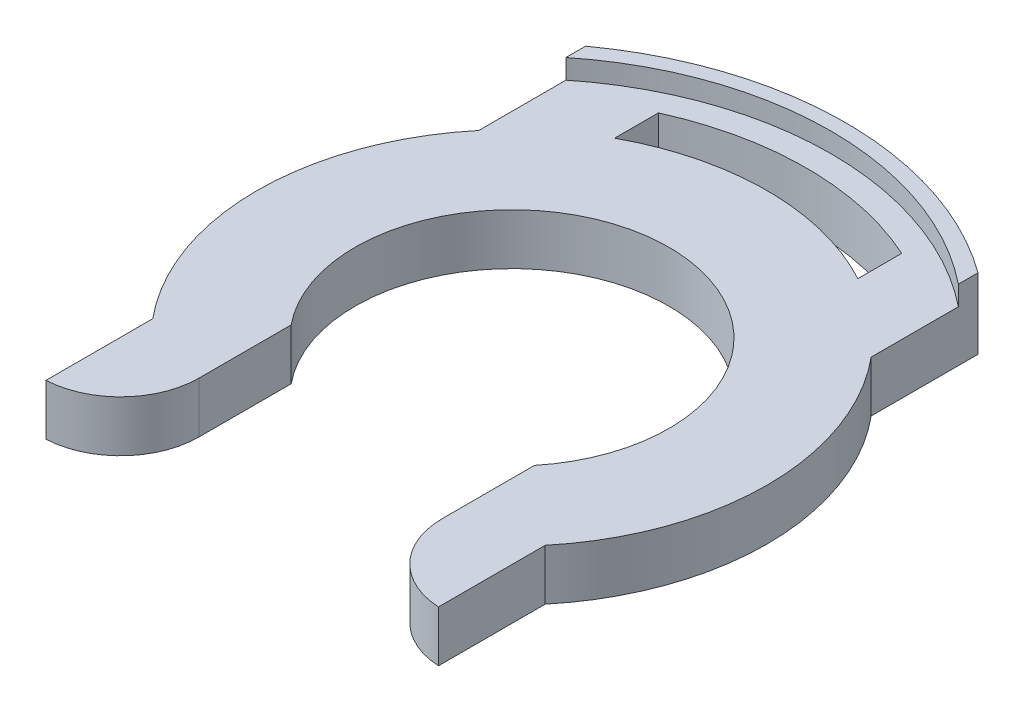
ISO-10303-21;
HEADER;
FILE_DESCRIPTION(('STEP AP214'),'2;1');
FILE_NAME('part.step','',(''),(''),'','','');
FILE_SCHEMA(('AUTOMOTIVE_DESIGN { 1 0 10303 214 1 1 1 1 }'));
ENDSEC;
DATA;
#1=APPLICATION_CONTEXT('core data for automotive mechanical design processes');
#2=APPLICATION_PROTOCOL_DEFINITION('international standard','automotive_design',2000,#1);
#3=PRODUCT_CONTEXT('',#1,'mechanical');
#4=PRODUCT('Part','Part','',(#3));
#5=PRODUCT_RELATED_PRODUCT_CATEGORY('part','',(#4));
#6=PRODUCT_DEFINITION_FORMATION('','',#4);
#7=PRODUCT_DEFINITION_CONTEXT('part definition',#1,'design');
#8=PRODUCT_DEFINITION('design','',#6,#7);
#9=PRODUCT_DEFINITION_SHAPE('','',#8);
#10=(LENGTH_UNIT() NAMED_UNIT(*) SI_UNIT(.MILLI.,.METRE.));
#11=(NAMED_UNIT(*) PLANE_ANGLE_UNIT() SI_UNIT($,.RADIAN.));
#12=(NAMED_UNIT(*) SI_UNIT($,.STERADIAN.) SOLID_ANGLE_UNIT());
#13=UNCERTAINTY_MEASURE_WITH_UNIT(LENGTH_MEASURE(1.E-05),#10,'distance_accuracy_value','');
#14=(GEOMETRIC_REPRESENTATION_CONTEXT(3) GLOBAL_UNCERTAINTY_ASSIGNED_CONTEXT((#13)) GLOBAL_UNIT_ASSIGNED_CONTEXT((#10,
#11,#12)) REPRESENTATION_CONTEXT('',''));
#15=CARTESIAN_POINT('',(0.,0.,0.));
#16=DIRECTION('',(0.,0.,1.));
#17=DIRECTION('',(1.,0.,0.));
#18=AXIS2_PLACEMENT_3D('',#15,#16,#17);
#19=CARTESIAN_POINT('',(0.,1.3,0.));
#20=DIRECTION('',(0.,1.,0.));
#21=DIRECTION('',(0.,0.,1.));
#22=AXIS2_PLACEMENT_3D('',#19,#20,#21);
#23=PLANE('',#22);
#24=DIRECTION('',(0.,0.,1.));
#25=VECTOR('',#24,1.);
#26=CARTESIAN_POINT('',(-34.3634624020238,1.3,0.));
#27=LINE('',#26,#25);
#28=CARTESIAN_POINT('',(-34.3634624020238,1.3,-13.1649759695658));
#29=VERTEX_POINT('',#28);
#30=CARTESIAN_POINT('',(-34.3634624020238,1.3,-12.0487702808145));
#31=VERTEX_POINT('',#30);
#32=EDGE_CURVE('E205',#29,#31,#27,.T.);
#33=ORIENTED_EDGE('',*,*,#32,.F.);
#34=CARTESIAN_POINT('',(-31.2634624020238,1.3,-6.33562753798022));
#35=DIRECTION('',(0.,1.,0.));
#36=DIRECTION('',(0.,0.,1.));
#37=AXIS2_PLACEMENT_3D('',#34,#35,#36);
#38=CIRCLE('',#37,7.5);
#39=CARTESIAN_POINT('',(-28.1634624020238,1.3,-13.1649759695658));
#40=VERTEX_POINT('',#39);
#41=EDGE_CURVE('E209',#40,#29,#38,.T.);
#42=ORIENTED_EDGE('',*,*,#41,.F.);
#43=DIRECTION('',(0.,0.,1.));
#44=VECTOR('',#43,1.);
#45=CARTESIAN_POINT('',(-28.1634624020238,1.3,0.));
#46=LINE('',#45,#44);
#47=CARTESIAN_POINT('',(-28.1634624020238,1.3,-12.0487702808145));
#48=VERTEX_POINT('',#47);
#49=EDGE_CURVE('E214',#40,#48,#46,.T.);
#50=ORIENTED_EDGE('',*,*,#49,.T.);
#51=CARTESIAN_POINT('',(-31.2634624020238,1.3,-6.33562753798022));
#52=DIRECTION('',(0.,1.,0.));
#53=DIRECTION('',(0.,0.,1.));
#54=AXIS2_PLACEMENT_3D('',#51,#52,#53);
#55=CIRCLE('',#54,6.5);
#56=EDGE_CURVE('E217',#48,#31,#55,.T.);
#57=ORIENTED_EDGE('',*,*,#56,.T.);
#58=EDGE_LOOP('',(#33,#42,#50,#57));
#59=FACE_BOUND('',#58,.T.);
#60=CARTESIAN_POINT('',(-31.2634624020238,1.3,-6.46449308201558));
#61=DIRECTION('',(0.,-1.,0.));
#62=DIRECTION('',(0.,0.,-1.));
#63=AXIS2_PLACEMENT_3D('',#60,#61,#62);
#64=CIRCLE('',#63,8.);
#65=CARTESIAN_POINT('',(-36.2634624020238,1.3,-12.709491080414));
#66=VERTEX_POINT('',#65);
#67=CARTESIAN_POINT('',(-26.2634624020238,1.3,-12.709491080414));
#68=VERTEX_POINT('',#67);
#69=EDGE_CURVE('E57',#66,#68,#64,.T.);
#70=ORIENTED_EDGE('',*,*,#69,.F.);
#71=DIRECTION('',(0.,0.,-1.));
#72=VECTOR('',#71,1.);
#73=CARTESIAN_POINT('',(-36.2634624020238,1.3,0.));
#74=LINE('',#73,#72);
#75=CARTESIAN_POINT('',(-36.2634624020238,1.3,-10.4889394694393));
#76=VERTEX_POINT('',#75);
#77=EDGE_CURVE('E232',#76,#66,#74,.T.);
#78=ORIENTED_EDGE('',*,*,#77,.F.);
#79=CARTESIAN_POINT('',(-31.2634624020238,1.3,-6.33562753798022));
#80=DIRECTION('',(0.,1.,0.));
#81=DIRECTION('',(0.,0.,1.));
#82=AXIS2_PLACEMENT_3D('',#79,#80,#81);
#83=CIRCLE('',#82,6.5);
#84=CARTESIAN_POINT('',(-36.2634624020238,1.3,-2.18231560652117));
#85=VERTEX_POINT('',#84);
#86=EDGE_CURVE('E235',#76,#85,#83,.T.);
#87=ORIENTED_EDGE('',*,*,#86,.T.);
#88=DIRECTION('',(0.,0.,-1.));
#89=VECTOR('',#88,1.);
#90=CARTESIAN_POINT('',(-36.2634624020238,1.3,0.));
#91=LINE('',#90,#89);
#92=CARTESIAN_POINT('',(-36.2634624020238,1.3,0.538236004453547));
#93=VERTEX_POINT('',#92);
#94=EDGE_CURVE('E238',#93,#85,#91,.T.);
#95=ORIENTED_EDGE('',*,*,#94,.F.);
#96=CARTESIAN_POINT('',(-36.3634624020238,1.3,-1.45926243109027));
#97=DIRECTION('',(0.,1.,0.));
#98=DIRECTION('',(0.,0.,1.));
#99=AXIS2_PLACEMENT_3D('',#96,#97,#98);
#100=CIRCLE('',#99,2.);
#101=CARTESIAN_POINT('',(-34.3634624020238,1.3,-1.45926243109027));
#102=VERTEX_POINT('',#101);
#103=EDGE_CURVE('E50',#93,#102,#100,.T.);
#104=ORIENTED_EDGE('',*,*,#103,.T.);
#105=DIRECTION('',(0.,0.,1.));
#106=VECTOR('',#105,1.);
#107=CARTESIAN_POINT('',(-34.3634624020238,1.3,0.));
#108=LINE('',#107,#106);
#109=CARTESIAN_POINT('',(-34.3634624020238,1.3,-3.8077826060273));
#110=VERTEX_POINT('',#109);
#111=EDGE_CURVE('E242',#110,#102,#108,.T.);
#112=ORIENTED_EDGE('',*,*,#111,.F.);
#113=CARTESIAN_POINT('',(-31.2634624020238,1.3,-6.33562753798022));
#114=DIRECTION('',(0.,1.,0.));
#115=DIRECTION('',(0.,0.,1.));
#116=AXIS2_PLACEMENT_3D('',#113,#114,#115);
#117=CIRCLE('',#116,4.);
#118=CARTESIAN_POINT('',(-28.1634624020238,1.3,-3.80778260602731));
#119=VERTEX_POINT('',#118);
#120=EDGE_CURVE('E246',#119,#110,#117,.T.);
#121=ORIENTED_EDGE('',*,*,#120,.F.);
#122=DIRECTION('',(0.,0.,1.));
#123=VECTOR('',#122,1.);
#124=CARTESIAN_POINT('',(-28.1634624020238,1.3,0.));
#125=LINE('',#124,#123);
#126=CARTESIAN_POINT('',(-28.1634624020238,1.3,-1.45926243109027));
#127=VERTEX_POINT('',#126);
#128=EDGE_CURVE('E220',#119,#127,#125,.T.);
#129=ORIENTED_EDGE('',*,*,#128,.T.);
#130=CARTESIAN_POINT('',(-26.1634624020238,1.3,-1.45926243109027));
#131=DIRECTION('',(0.,1.,0.));
#132=DIRECTION('',(0.,0.,1.));
#133=AXIS2_PLACEMENT_3D('',#130,#131,#132);
#134=CIRCLE('',#133,2.);
#135=CARTESIAN_POINT('',(-26.2634624020238,1.3,0.538236004453544));
#136=VERTEX_POINT('',#135);
#137=EDGE_CURVE('E351',#127,#136,#134,.T.);
#138=ORIENTED_EDGE('',*,*,#137,.T.);
#139=DIRECTION('',(0.,0.,-1.));
#140=VECTOR('',#139,1.);
#141=CARTESIAN_POINT('',(-26.2634624020238,1.3,0.));
#142=LINE('',#141,#140);
#143=CARTESIAN_POINT('',(-26.2634624020238,1.3,-2.18231560652118));
#144=VERTEX_POINT('',#143);
#145=EDGE_CURVE('E223',#136,#144,#142,.T.);
#146=ORIENTED_EDGE('',*,*,#145,.T.);
#147=CARTESIAN_POINT('',(-31.2634624020238,1.3,-6.33562753798022));
#148=DIRECTION('',(0.,1.,0.));
#149=DIRECTION('',(0.,0.,1.));
#150=AXIS2_PLACEMENT_3D('',#147,#148,#149);
#151=CIRCLE('',#150,6.5);
#152=CARTESIAN_POINT('',(-26.2634624020238,1.3,-10.4889394694393));
#153=VERTEX_POINT('',#152);
#154=EDGE_CURVE('E226',#144,#153,#151,.T.);
#155=ORIENTED_EDGE('',*,*,#154,.T.);
#156=DIRECTION('',(0.,0.,-1.));
#157=VECTOR('',#156,1.);
#158=CARTESIAN_POINT('',(-26.2634624020238,1.3,0.));
#159=LINE('',#158,#157);
#160=EDGE_CURVE('E229',#153,#68,#159,.T.);
#161=ORIENTED_EDGE('',*,*,#160,.T.);
#162=EDGE_LOOP('',(#70,#78,#87,#95,#104,#112,#121,#129,#138,#146,#155,#161));
#163=FACE_BOUND('',#162,.T.);
#164=ADVANCED_FACE('F41',(#59,#163),#23,.T.);
#165=CARTESIAN_POINT('',(-28.1634624020238,1.3,0.));
#166=DIRECTION('',(1.,0.,0.));
#167=DIRECTION('',(0.,0.,-1.));
#168=AXIS2_PLACEMENT_3D('',#165,#166,#167);
#169=PLANE('',#168);
#170=DIRECTION('',(0.,0.,1.));
#171=VECTOR('',#170,1.);
#172=CARTESIAN_POINT('',(-28.1634624020238,0.,0.));
#173=LINE('',#172,#171);
#174=CARTESIAN_POINT('',(-28.1634624020238,0.,-3.80778260602731));
#175=VERTEX_POINT('',#174);
#176=CARTESIAN_POINT('',(-28.1634624020238,0.,-1.45926243109027));
#177=VERTEX_POINT('',#176);
#178=EDGE_CURVE('E261',#175,#177,#173,.T.);
#179=ORIENTED_EDGE('',*,*,#178,.T.);
#180=DIRECTION('',(0.,-1.,0.));
#181=VECTOR('',#180,1.);
#182=CARTESIAN_POINT('',(-28.1634624020238,1.3,-1.45926243109027));
#183=LINE('',#182,#181);
#184=EDGE_CURVE('E11',#177,#127,#183,.F.);
#185=ORIENTED_EDGE('',*,*,#184,.T.);
#186=ORIENTED_EDGE('',*,*,#128,.F.);
#187=DIRECTION('',(0.,-1.,0.));
#188=VECTOR('',#187,1.);
#189=CARTESIAN_POINT('',(-28.1634624020238,1.3,-3.80778260602731));
#190=LINE('',#189,#188);
#191=EDGE_CURVE('E296',#119,#175,#190,.T.);
#192=ORIENTED_EDGE('',*,*,#191,.T.);
#193=EDGE_LOOP('',(#179,#185,#186,#192));
#194=FACE_BOUND('',#193,.T.);
#195=ADVANCED_FACE('F395',(#194),#169,.F.);
#196=CARTESIAN_POINT('',(-26.2634624020238,1.3,0.));
#197=DIRECTION('',(-1.,0.,0.));
#198=DIRECTION('',(0.,0.,1.));
#199=AXIS2_PLACEMENT_3D('',#196,#197,#198);
#200=PLANE('',#199);
#201=DIRECTION('',(0.,0.,-1.));
#202=VECTOR('',#201,1.);
#203=CARTESIAN_POINT('',(-26.2634624020238,0.,0.));
#204=LINE('',#203,#202);
#205=CARTESIAN_POINT('',(-26.2634624020238,0.,0.538236004453544));
#206=VERTEX_POINT('',#205);
#207=CARTESIAN_POINT('',(-26.2634624020238,0.,-2.18231560652118));
#208=VERTEX_POINT('',#207);
#209=EDGE_CURVE('E264',#206,#208,#204,.T.);
#210=ORIENTED_EDGE('',*,*,#209,.T.);
#211=DIRECTION('',(0.,-1.,0.));
#212=VECTOR('',#211,1.);
#213=CARTESIAN_POINT('',(-26.2634624020238,1.3,-2.18231560652118));
#214=LINE('',#213,#212);
#215=EDGE_CURVE('E322',#144,#208,#214,.T.);
#216=ORIENTED_EDGE('',*,*,#215,.F.);
#217=ORIENTED_EDGE('',*,*,#145,.F.);
#218=DIRECTION('',(0.,-1.,0.));
#219=VECTOR('',#218,1.);
#220=CARTESIAN_POINT('',(-26.2634624020238,1.3,0.538236004453544));
#221=LINE('',#220,#219);
#222=EDGE_CURVE('E326',#136,#206,#221,.T.);
#223=ORIENTED_EDGE('',*,*,#222,.T.);
#224=EDGE_LOOP('',(#210,#216,#217,#223));
#225=FACE_BOUND('',#224,.T.);
#226=ADVANCED_FACE('F390',(#225),#200,.F.);
#227=CARTESIAN_POINT('',(-31.2634624020238,1.3,-6.33562753798022));
#228=DIRECTION('',(0.,-1.,0.));
#229=DIRECTION('',(0.,0.,-1.));
#230=AXIS2_PLACEMENT_3D('',#227,#228,#229);
#231=CYLINDRICAL_SURFACE('',#230,6.5);
#232=CARTESIAN_POINT('',(-31.2634624020238,0.,-6.33562753798022));
#233=DIRECTION('',(0.,1.,0.));
#234=DIRECTION('',(0.,0.,1.));
#235=AXIS2_PLACEMENT_3D('',#232,#233,#234);
#236=CIRCLE('',#235,6.5);
#237=CARTESIAN_POINT('',(-26.2634624020238,0.,-10.4889394694393));
#238=VERTEX_POINT('',#237);
#239=EDGE_CURVE('E267',#208,#238,#236,.T.);
#240=ORIENTED_EDGE('',*,*,#239,.T.);
#241=DIRECTION('',(0.,-1.,0.));
#242=VECTOR('',#241,1.);
#243=CARTESIAN_POINT('',(-26.2634624020238,1.3,-10.4889394694393));
#244=LINE('',#243,#242);
#245=EDGE_CURVE('E318',#153,#238,#244,.T.);
#246=ORIENTED_EDGE('',*,*,#245,.F.);
#247=ORIENTED_EDGE('',*,*,#154,.F.);
#248=ORIENTED_EDGE('',*,*,#215,.T.);
#249=EDGE_LOOP('',(#240,#246,#247,#248));
#250=FACE_BOUND('',#249,.T.);
#251=ADVANCED_FACE('F386',(#250),#231,.T.);
#252=CARTESIAN_POINT('',(-26.2634624020238,1.3,0.));
#253=DIRECTION('',(-1.,0.,0.));
#254=DIRECTION('',(0.,0.,1.));
#255=AXIS2_PLACEMENT_3D('',#252,#253,#254);
#256=PLANE('',#255);
#257=DIRECTION('',(0.,0.,-1.));
#258=VECTOR('',#257,1.);
#259=CARTESIAN_POINT('',(-26.2634624020238,0.,0.));
#260=LINE('',#259,#258);
#261=CARTESIAN_POINT('',(-26.2634624020238,0.,-13.209491080414));
#262=VERTEX_POINT('',#261);
#263=EDGE_CURVE('E270',#238,#262,#260,.T.);
#264=ORIENTED_EDGE('',*,*,#263,.T.);
#265=DIRECTION('',(0.,-1.,0.));
#266=VECTOR('',#265,1.);
#267=CARTESIAN_POINT('',(-26.2634624020238,1.3,-13.209491080414));
#268=LINE('',#267,#266);
#269=CARTESIAN_POINT('',(-26.2634624020238,1.8,-13.209491080414));
#270=VERTEX_POINT('',#269);
#271=EDGE_CURVE('E175',#270,#262,#268,.T.);
#272=ORIENTED_EDGE('',*,*,#271,.F.);
#273=DIRECTION('',(0.,0.,-1.));
#274=VECTOR('',#273,1.);
#275=CARTESIAN_POINT('',(-26.2634624020238,1.8,-12.709491080414));
#276=LINE('',#275,#274);
#277=CARTESIAN_POINT('',(-26.2634624020238,1.8,-12.709491080414));
#278=VERTEX_POINT('',#277);
#279=EDGE_CURVE('E168',#278,#270,#276,.T.);
#280=ORIENTED_EDGE('',*,*,#279,.F.);
#281=DIRECTION('',(0.,-1.,0.));
#282=VECTOR('',#281,1.);
#283=CARTESIAN_POINT('',(-26.2634624020238,1.8,-12.709491080414));
#284=LINE('',#283,#282);
#285=EDGE_CURVE('E173',#278,#68,#284,.T.);
#286=ORIENTED_EDGE('',*,*,#285,.T.);
#287=ORIENTED_EDGE('',*,*,#160,.F.);
#288=ORIENTED_EDGE('',*,*,#245,.T.);
#289=EDGE_LOOP('',(#264,#272,#280,#286,#287,#288));
#290=FACE_BOUND('',#289,.T.);
#291=ADVANCED_FACE('F170',(#290),#256,.F.);
#292=CARTESIAN_POINT('',(-31.2634624020238,1.3,-6.33562753798022));
#293=DIRECTION('',(0.,-1.,0.));
#294=DIRECTION('',(0.,0.,-1.));
#295=AXIS2_PLACEMENT_3D('',#292,#293,#294);
#296=CYLINDRICAL_SURFACE('',#295,8.5);
#297=CARTESIAN_POINT('',(-31.2634624020238,0.,-6.33562753798022));
#298=DIRECTION('',(0.,1.,0.));
#299=DIRECTION('',(0.,0.,1.));
#300=AXIS2_PLACEMENT_3D('',#297,#298,#299);
#301=CIRCLE('',#300,8.5);
#302=CARTESIAN_POINT('',(-36.2634624020238,0.,-13.209491080414));
#303=VERTEX_POINT('',#302);
#304=EDGE_CURVE('E273',#262,#303,#301,.T.);
#305=ORIENTED_EDGE('',*,*,#304,.T.);
#306=DIRECTION('',(0.,-1.,0.));
#307=VECTOR('',#306,1.);
#308=CARTESIAN_POINT('',(-36.2634624020238,1.3,-13.209491080414));
#309=LINE('',#308,#307);
#310=CARTESIAN_POINT('',(-36.2634624020238,1.8,-13.209491080414));
#311=VERTEX_POINT('',#310);
#312=EDGE_CURVE('E313',#311,#303,#309,.T.);
#313=ORIENTED_EDGE('',*,*,#312,.F.);
#314=CARTESIAN_POINT('',(-31.2634624020238,1.8,-6.3356275379802));
#315=DIRECTION('',(0.,1.,0.));
#316=DIRECTION('',(0.,0.,-1.));
#317=AXIS2_PLACEMENT_3D('',#314,#315,#316);
#318=CIRCLE('',#317,8.50000000000001);
#319=EDGE_CURVE('E180',#270,#311,#318,.T.);
#320=ORIENTED_EDGE('',*,*,#319,.F.);
#321=ORIENTED_EDGE('',*,*,#271,.T.);
#322=EDGE_LOOP('',(#305,#313,#320,#321));
#323=FACE_BOUND('',#322,.T.);
#324=ADVANCED_FACE('F379',(#323),#296,.T.);
#325=CARTESIAN_POINT('',(-36.2634624020238,1.3,0.));
#326=DIRECTION('',(-1.,0.,0.));
#327=DIRECTION('',(0.,0.,1.));
#328=AXIS2_PLACEMENT_3D('',#325,#326,#327);
#329=PLANE('',#328);
#330=DIRECTION('',(0.,0.,-1.));
#331=VECTOR('',#330,1.);
#332=CARTESIAN_POINT('',(-36.2634624020238,0.,0.));
#333=LINE('',#332,#331);
#334=CARTESIAN_POINT('',(-36.2634624020238,0.,-10.4889394694393));
#335=VERTEX_POINT('',#334);
#336=EDGE_CURVE('E277',#335,#303,#333,.T.);
#337=ORIENTED_EDGE('',*,*,#336,.F.);
#338=DIRECTION('',(0.,-1.,0.));
#339=VECTOR('',#338,1.);
#340=CARTESIAN_POINT('',(-36.2634624020238,1.3,-10.4889394694393));
#341=LINE('',#340,#339);
#342=EDGE_CURVE('E310',#76,#335,#341,.T.);
#343=ORIENTED_EDGE('',*,*,#342,.F.);
#344=ORIENTED_EDGE('',*,*,#77,.T.);
#345=DIRECTION('',(0.,-1.,0.));
#346=VECTOR('',#345,1.);
#347=CARTESIAN_POINT('',(-36.2634624020238,1.8,-12.709491080414));
#348=LINE('',#347,#346);
#349=CARTESIAN_POINT('',(-36.2634624020238,1.8,-12.709491080414));
#350=VERTEX_POINT('',#349);
#351=EDGE_CURVE('E195',#350,#66,#348,.T.);
#352=ORIENTED_EDGE('',*,*,#351,.F.);
#353=DIRECTION('',(0.,0.,1.));
#354=VECTOR('',#353,1.);
#355=CARTESIAN_POINT('',(-36.2634624020238,1.8,-12.709491080414));
#356=LINE('',#355,#354);
#357=EDGE_CURVE('E186',#311,#350,#356,.T.);
#358=ORIENTED_EDGE('',*,*,#357,.F.);
#359=ORIENTED_EDGE('',*,*,#312,.T.);
#360=EDGE_LOOP('',(#337,#343,#344,#352,#358,#359));
#361=FACE_BOUND('',#360,.T.);
#362=ADVANCED_FACE('F377',(#361),#329,.T.);
#363=CARTESIAN_POINT('',(-31.2634624020238,1.3,-6.33562753798022));
#364=DIRECTION('',(0.,-1.,0.));
#365=DIRECTION('',(0.,0.,-1.));
#366=AXIS2_PLACEMENT_3D('',#363,#364,#365);
#367=CYLINDRICAL_SURFACE('',#366,6.5);
#368=CARTESIAN_POINT('',(-31.2634624020238,0.,-6.33562753798022));
#369=DIRECTION('',(0.,1.,0.));
#370=DIRECTION('',(0.,0.,1.));
#371=AXIS2_PLACEMENT_3D('',#368,#369,#370);
#372=CIRCLE('',#371,6.5);
#373=CARTESIAN_POINT('',(-36.2634624020238,0.,-2.18231560652117));
#374=VERTEX_POINT('',#373);
#375=EDGE_CURVE('E281',#335,#374,#372,.T.);
#376=ORIENTED_EDGE('',*,*,#375,.T.);
#377=DIRECTION('',(0.,-1.,0.));
#378=VECTOR('',#377,1.);
#379=CARTESIAN_POINT('',(-36.2634624020238,1.3,-2.18231560652117));
#380=LINE('',#379,#378);
#381=EDGE_CURVE('E307',#85,#374,#380,.T.);
#382=ORIENTED_EDGE('',*,*,#381,.F.);
#383=ORIENTED_EDGE('',*,*,#86,.F.);
#384=ORIENTED_EDGE('',*,*,#342,.T.);
#385=EDGE_LOOP('',(#376,#382,#383,#384));
#386=FACE_BOUND('',#385,.T.);
#387=ADVANCED_FACE('F373',(#386),#367,.T.);
#388=CARTESIAN_POINT('',(-36.2634624020238,1.3,0.));
#389=DIRECTION('',(-1.,0.,0.));
#390=DIRECTION('',(0.,0.,1.));
#391=AXIS2_PLACEMENT_3D('',#388,#389,#390);
#392=PLANE('',#391);
#393=DIRECTION('',(0.,0.,-1.));
#394=VECTOR('',#393,1.);
#395=CARTESIAN_POINT('',(-36.2634624020238,0.,0.));
#396=LINE('',#395,#394);
#397=CARTESIAN_POINT('',(-36.2634624020238,0.,0.538236004453547));
#398=VERTEX_POINT('',#397);
#399=EDGE_CURVE('E285',#398,#374,#396,.T.);
#400=ORIENTED_EDGE('',*,*,#399,.F.);
#401=DIRECTION('',(0.,-1.,0.));
#402=VECTOR('',#401,1.);
#403=CARTESIAN_POINT('',(-36.2634624020238,1.3,0.538236004453547));
#404=LINE('',#403,#402);
#405=EDGE_CURVE('E303',#93,#398,#404,.T.);
#406=ORIENTED_EDGE('',*,*,#405,.F.);
#407=ORIENTED_EDGE('',*,*,#94,.T.);
#408=ORIENTED_EDGE('',*,*,#381,.T.);
#409=EDGE_LOOP('',(#400,#406,#407,#408));
#410=FACE_BOUND('',#409,.T.);
#411=ADVANCED_FACE('F369',(#410),#392,.T.);
#412=CARTESIAN_POINT('',(-34.3634624020238,1.3,0.));
#413=DIRECTION('',(1.,0.,0.));
#414=DIRECTION('',(0.,0.,-1.));
#415=AXIS2_PLACEMENT_3D('',#412,#413,#414);
#416=PLANE('',#415);
#417=ORIENTED_EDGE('',*,*,#111,.T.);
#418=DIRECTION('',(0.,1.,0.));
#419=VECTOR('',#418,1.);
#420=CARTESIAN_POINT('',(-34.3634624020238,0.,-1.45926243109027));
#421=LINE('',#420,#419);
#422=CARTESIAN_POINT('',(-34.3634624020238,0.,-1.45926243109027));
#423=VERTEX_POINT('',#422);
#424=EDGE_CURVE('E330',#102,#423,#421,.F.);
#425=ORIENTED_EDGE('',*,*,#424,.T.);
#426=DIRECTION('',(0.,0.,1.));
#427=VECTOR('',#426,1.);
#428=CARTESIAN_POINT('',(-34.3634624020238,0.,0.));
#429=LINE('',#428,#427);
#430=CARTESIAN_POINT('',(-34.3634624020238,0.,-3.8077826060273));
#431=VERTEX_POINT('',#430);
#432=EDGE_CURVE('E289',#431,#423,#429,.T.);
#433=ORIENTED_EDGE('',*,*,#432,.F.);
#434=DIRECTION('',(0.,-1.,0.));
#435=VECTOR('',#434,1.);
#436=CARTESIAN_POINT('',(-34.3634624020238,1.3,-3.8077826060273));
#437=LINE('',#436,#435);
#438=EDGE_CURVE('E299',#110,#431,#437,.T.);
#439=ORIENTED_EDGE('',*,*,#438,.F.);
#440=EDGE_LOOP('',(#417,#425,#433,#439));
#441=FACE_BOUND('',#440,.T.);
#442=ADVANCED_FACE('F361',(#441),#416,.T.);
#443=CARTESIAN_POINT('',(-34.3634624020238,1.3,0.));
#444=DIRECTION('',(1.,0.,0.));
#445=DIRECTION('',(0.,0.,-1.));
#446=AXIS2_PLACEMENT_3D('',#443,#444,#445);
#447=PLANE('',#446);
#448=DIRECTION('',(0.,0.,1.));
#449=VECTOR('',#448,1.);
#450=CARTESIAN_POINT('',(-34.3634624020238,0.,0.));
#451=LINE('',#450,#449);
#452=CARTESIAN_POINT('',(-34.3634624020238,0.,-13.1649759695658));
#453=VERTEX_POINT('',#452);
#454=CARTESIAN_POINT('',(-34.3634624020238,0.,-12.0487702808145));
#455=VERTEX_POINT('',#454);
#456=EDGE_CURVE('E194',#453,#455,#451,.T.);
#457=ORIENTED_EDGE('',*,*,#456,.F.);
#458=DIRECTION('',(0.,-1.,0.));
#459=VECTOR('',#458,1.);
#460=CARTESIAN_POINT('',(-34.3634624020238,1.3,-13.1649759695658));
#461=LINE('',#460,#459);
#462=EDGE_CURVE('E300',#29,#453,#461,.T.);
#463=ORIENTED_EDGE('',*,*,#462,.F.);
#464=ORIENTED_EDGE('',*,*,#32,.T.);
#465=DIRECTION('',(0.,-1.,0.));
#466=VECTOR('',#465,1.);
#467=CARTESIAN_POINT('',(-34.3634624020238,1.3,-12.0487702808145));
#468=LINE('',#467,#466);
#469=EDGE_CURVE('E249',#31,#455,#468,.T.);
#470=ORIENTED_EDGE('',*,*,#469,.T.);
#471=EDGE_LOOP('',(#457,#463,#464,#470));
#472=FACE_BOUND('',#471,.T.);
#473=ADVANCED_FACE('F455',(#472),#447,.T.);
#474=CARTESIAN_POINT('',(-31.2634624020238,1.3,-6.33562753798022));
#475=DIRECTION('',(0.,-1.,0.));
#476=DIRECTION('',(0.,0.,-1.));
#477=AXIS2_PLACEMENT_3D('',#474,#475,#476);
#478=CYLINDRICAL_SURFACE('',#477,7.5);
#479=CARTESIAN_POINT('',(-31.2634624020238,0.,-6.33562753798022));
#480=DIRECTION('',(0.,1.,0.));
#481=DIRECTION('',(0.,0.,1.));
#482=AXIS2_PLACEMENT_3D('',#479,#480,#481);
#483=CIRCLE('',#482,7.5);
#484=CARTESIAN_POINT('',(-28.1634624020238,0.,-13.1649759695658));
#485=VERTEX_POINT('',#484);
#486=EDGE_CURVE('E200',#485,#453,#483,.T.);
#487=ORIENTED_EDGE('',*,*,#486,.F.);
#488=DIRECTION('',(0.,-1.,0.));
#489=VECTOR('',#488,1.);
#490=CARTESIAN_POINT('',(-28.1634624020238,1.3,-13.1649759695658));
#491=LINE('',#490,#489);
#492=EDGE_CURVE('E337',#40,#485,#491,.T.);
#493=ORIENTED_EDGE('',*,*,#492,.F.);
#494=ORIENTED_EDGE('',*,*,#41,.T.);
#495=ORIENTED_EDGE('',*,*,#462,.T.);
#496=EDGE_LOOP('',(#487,#493,#494,#495));
#497=FACE_BOUND('',#496,.T.);
#498=ADVANCED_FACE('F502',(#497),#478,.F.);
#499=CARTESIAN_POINT('',(-28.1634624020238,1.3,0.));
#500=DIRECTION('',(1.,0.,0.));
#501=DIRECTION('',(0.,0.,-1.));
#502=AXIS2_PLACEMENT_3D('',#499,#500,#501);
#503=PLANE('',#502);
#504=DIRECTION('',(0.,0.,1.));
#505=VECTOR('',#504,1.);
#506=CARTESIAN_POINT('',(-28.1634624020238,0.,0.));
#507=LINE('',#506,#505);
#508=CARTESIAN_POINT('',(-28.1634624020238,0.,-12.0487702808145));
#509=VERTEX_POINT('',#508);
#510=EDGE_CURVE('E254',#485,#509,#507,.T.);
#511=ORIENTED_EDGE('',*,*,#510,.T.);
#512=DIRECTION('',(0.,-1.,0.));
#513=VECTOR('',#512,1.);
#514=CARTESIAN_POINT('',(-28.1634624020238,1.3,-12.0487702808145));
#515=LINE('',#514,#513);
#516=EDGE_CURVE('E333',#48,#509,#515,.T.);
#517=ORIENTED_EDGE('',*,*,#516,.F.);
#518=ORIENTED_EDGE('',*,*,#49,.F.);
#519=ORIENTED_EDGE('',*,*,#492,.T.);
#520=EDGE_LOOP('',(#511,#517,#518,#519));
#521=FACE_BOUND('',#520,.T.);
#522=ADVANCED_FACE('F408',(#521),#503,.F.);
#523=CARTESIAN_POINT('',(-31.2634624020238,1.3,-6.33562753798022));
#524=DIRECTION('',(0.,-1.,0.));
#525=DIRECTION('',(0.,0.,-1.));
#526=AXIS2_PLACEMENT_3D('',#523,#524,#525);
#527=CYLINDRICAL_SURFACE('',#526,6.5);
#528=CARTESIAN_POINT('',(-31.2634624020238,0.,-6.33562753798022));
#529=DIRECTION('',(0.,1.,0.));
#530=DIRECTION('',(0.,0.,1.));
#531=AXIS2_PLACEMENT_3D('',#528,#529,#530);
#532=CIRCLE('',#531,6.5);
#533=EDGE_CURVE('E257',#509,#455,#532,.T.);
#534=ORIENTED_EDGE('',*,*,#533,.T.);
#535=ORIENTED_EDGE('',*,*,#469,.F.);
#536=ORIENTED_EDGE('',*,*,#56,.F.);
#537=ORIENTED_EDGE('',*,*,#516,.T.);
#538=EDGE_LOOP('',(#534,#535,#536,#537));
#539=FACE_BOUND('',#538,.T.);
#540=ADVANCED_FACE('F400',(#539),#527,.T.);
#541=CARTESIAN_POINT('',(-31.2634624020238,1.3,-6.33562753798022));
#542=DIRECTION('',(0.,-1.,0.));
#543=DIRECTION('',(0.,0.,-1.));
#544=AXIS2_PLACEMENT_3D('',#541,#542,#543);
#545=CYLINDRICAL_SURFACE('',#544,4.);
#546=CARTESIAN_POINT('',(-31.2634624020238,0.,-6.33562753798022));
#547=DIRECTION('',(0.,1.,0.));
#548=DIRECTION('',(0.,0.,1.));
#549=AXIS2_PLACEMENT_3D('',#546,#547,#548);
#550=CIRCLE('',#549,4.);
#551=EDGE_CURVE('E210',#175,#431,#550,.T.);
#552=ORIENTED_EDGE('',*,*,#551,.F.);
#553=ORIENTED_EDGE('',*,*,#191,.F.);
#554=ORIENTED_EDGE('',*,*,#120,.T.);
#555=ORIENTED_EDGE('',*,*,#438,.T.);
#556=EDGE_LOOP('',(#552,#553,#554,#555));
#557=FACE_BOUND('',#556,.T.);
#558=ADVANCED_FACE('F398',(#557),#545,.F.);
#559=CARTESIAN_POINT('',(0.,0.,0.));
#560=DIRECTION('',(0.,1.,0.));
#561=DIRECTION('',(0.,0.,1.));
#562=AXIS2_PLACEMENT_3D('',#559,#560,#561);
#563=PLANE('',#562);
#564=ORIENTED_EDGE('',*,*,#456,.T.);
#565=ORIENTED_EDGE('',*,*,#533,.F.);
#566=ORIENTED_EDGE('',*,*,#510,.F.);
#567=ORIENTED_EDGE('',*,*,#486,.T.);
#568=EDGE_LOOP('',(#564,#565,#566,#567));
#569=FACE_BOUND('',#568,.T.);
#570=ORIENTED_EDGE('',*,*,#432,.T.);
#571=CARTESIAN_POINT('',(-36.3634624020238,0.,-1.45926243109027));
#572=DIRECTION('',(0.,1.,0.));
#573=DIRECTION('',(0.,0.,1.));
#574=AXIS2_PLACEMENT_3D('',#571,#572,#573);
#575=CIRCLE('',#574,2.);
#576=EDGE_CURVE('E348',#423,#398,#575,.F.);
#577=ORIENTED_EDGE('',*,*,#576,.T.);
#578=ORIENTED_EDGE('',*,*,#399,.T.);
#579=ORIENTED_EDGE('',*,*,#375,.F.);
#580=ORIENTED_EDGE('',*,*,#336,.T.);
#581=ORIENTED_EDGE('',*,*,#304,.F.);
#582=ORIENTED_EDGE('',*,*,#263,.F.);
#583=ORIENTED_EDGE('',*,*,#239,.F.);
#584=ORIENTED_EDGE('',*,*,#209,.F.);
#585=CARTESIAN_POINT('',(-26.1634624020238,0.,-1.45926243109027));
#586=DIRECTION('',(0.,1.,0.));
#587=DIRECTION('',(0.,0.,1.));
#588=AXIS2_PLACEMENT_3D('',#585,#586,#587);
#589=CIRCLE('',#588,2.);
#590=EDGE_CURVE('E345',#206,#177,#589,.F.);
#591=ORIENTED_EDGE('',*,*,#590,.T.);
#592=ORIENTED_EDGE('',*,*,#178,.F.);
#593=ORIENTED_EDGE('',*,*,#551,.T.);
#594=EDGE_LOOP('',(#570,#577,#578,#579,#580,#581,#582,#583,#584,#591,#592,#593));
#595=FACE_BOUND('',#594,.T.);
#596=ADVANCED_FACE('F366',(#569,#595),#563,.F.);
#597=CARTESIAN_POINT('',(-36.3634624020238,1.3,-1.45926243109027));
#598=DIRECTION('',(0.,-1.,0.));
#599=DIRECTION('',(0.,0.,-1.));
#600=AXIS2_PLACEMENT_3D('',#597,#598,#599);
#601=CYLINDRICAL_SURFACE('',#600,2.);
#602=ORIENTED_EDGE('',*,*,#103,.F.);
#603=ORIENTED_EDGE('',*,*,#405,.T.);
#604=ORIENTED_EDGE('',*,*,#576,.F.);
#605=ORIENTED_EDGE('',*,*,#424,.F.);
#606=EDGE_LOOP('',(#602,#603,#604,#605));
#607=FACE_BOUND('',#606,.T.);
#608=ADVANCED_FACE('F363',(#607),#601,.T.);
#609=CARTESIAN_POINT('',(-26.1634624020238,1.3,-1.45926243109027));
#610=DIRECTION('',(0.,-1.,0.));
#611=DIRECTION('',(0.,0.,-1.));
#612=AXIS2_PLACEMENT_3D('',#609,#610,#611);
#613=CYLINDRICAL_SURFACE('',#612,2.);
#614=ORIENTED_EDGE('',*,*,#137,.F.);
#615=ORIENTED_EDGE('',*,*,#184,.F.);
#616=ORIENTED_EDGE('',*,*,#590,.F.);
#617=ORIENTED_EDGE('',*,*,#222,.F.);
#618=EDGE_LOOP('',(#614,#615,#616,#617));
#619=FACE_BOUND('',#618,.T.);
#620=ADVANCED_FACE('F43',(#619),#613,.T.);
#621=CARTESIAN_POINT('',(-31.2634624020238,1.8,-6.46449308201558));
#622=DIRECTION('',(0.,-1.,0.));
#623=DIRECTION('',(0.,0.,-1.));
#624=AXIS2_PLACEMENT_3D('',#621,#622,#623);
#625=CYLINDRICAL_SURFACE('',#624,8.);
#626=ORIENTED_EDGE('',*,*,#69,.T.);
#627=ORIENTED_EDGE('',*,*,#285,.F.);
#628=CARTESIAN_POINT('',(-31.2634624020238,1.8,-6.46449308201558));
#629=DIRECTION('',(0.,-1.,0.));
#630=DIRECTION('',(0.,0.,-1.));
#631=AXIS2_PLACEMENT_3D('',#628,#629,#630);
#632=CIRCLE('',#631,8.);
#633=EDGE_CURVE('E181',#350,#278,#632,.T.);
#634=ORIENTED_EDGE('',*,*,#633,.F.);
#635=ORIENTED_EDGE('',*,*,#351,.T.);
#636=EDGE_LOOP('',(#626,#627,#634,#635));
#637=FACE_BOUND('',#636,.T.);
#638=ADVANCED_FACE('F192',(#637),#625,.F.);
#639=CARTESIAN_POINT('',(-31.2634624020238,1.8,-6.46449308201558));
#640=DIRECTION('',(0.,-1.,0.));
#641=DIRECTION('',(0.,0.,-1.));
#642=AXIS2_PLACEMENT_3D('',#639,#640,#641);
#643=PLANE('',#642);
#644=ORIENTED_EDGE('',*,*,#633,.T.);
#645=ORIENTED_EDGE('',*,*,#279,.T.);
#646=ORIENTED_EDGE('',*,*,#319,.T.);
#647=ORIENTED_EDGE('',*,*,#357,.T.);
#648=EDGE_LOOP('',(#644,#645,#646,#647));
#649=FACE_BOUND('',#648,.T.);
#650=ADVANCED_FACE('F184',(#649),#643,.F.);
#651=CLOSED_SHELL('',(#164,#195,#226,#251,#291,#324,#362,#387,#411,#442,#473,#498,#522,#540,
#558,#596,#608,#620,#638,#650));
#652=MANIFOLD_SOLID_BREP('B2',#651);
#653=ADVANCED_BREP_SHAPE_REPRESENTATION('',(#18,#652),#14);
#654=SHAPE_DEFINITION_REPRESENTATION(#9,#653);
ENDSEC;
END-ISO-10303-21;
